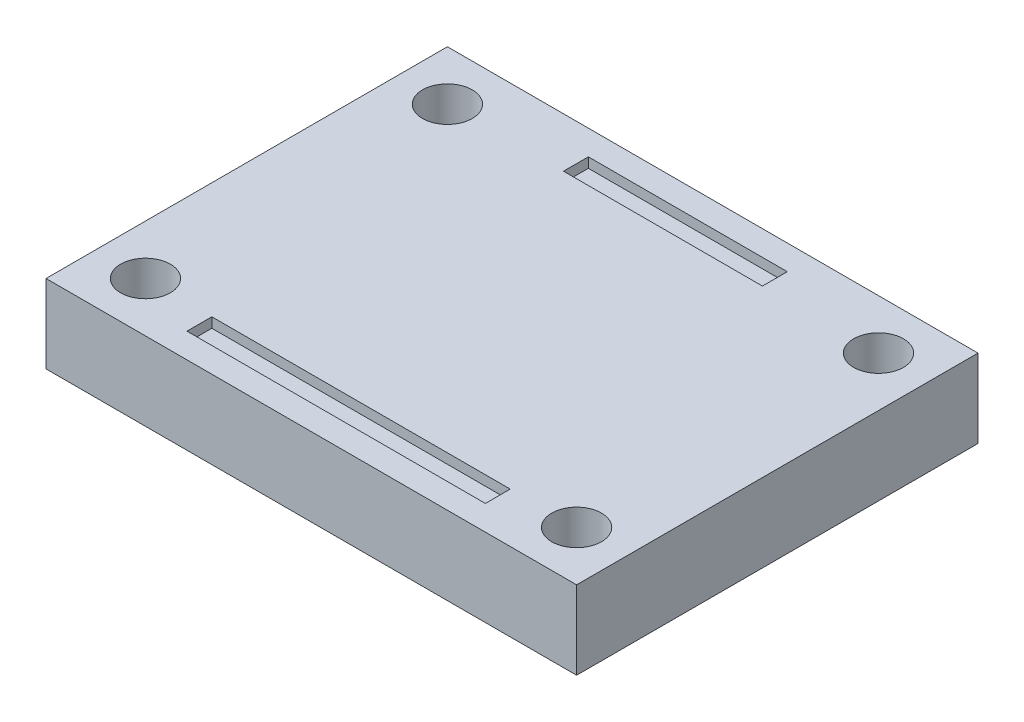
ISO-10303-21;
HEADER;
FILE_DESCRIPTION(('STEP AP214'),'2;1');
FILE_NAME('part.step','',(''),(''),'','','');
FILE_SCHEMA(('AUTOMOTIVE_DESIGN { 1 0 10303 214 1 1 1 1 }'));
ENDSEC;
DATA;
#1=APPLICATION_CONTEXT('core data for automotive mechanical design processes');
#2=APPLICATION_PROTOCOL_DEFINITION('international standard','automotive_design',2000,#1);
#3=PRODUCT_CONTEXT('',#1,'mechanical');
#4=PRODUCT('Part','Part','',(#3));
#5=PRODUCT_RELATED_PRODUCT_CATEGORY('part','',(#4));
#6=PRODUCT_DEFINITION_FORMATION('','',#4);
#7=PRODUCT_DEFINITION_CONTEXT('part definition',#1,'design');
#8=PRODUCT_DEFINITION('design','',#6,#7);
#9=PRODUCT_DEFINITION_SHAPE('','',#8);
#10=(LENGTH_UNIT() NAMED_UNIT(*) SI_UNIT(.MILLI.,.METRE.));
#11=(NAMED_UNIT(*) PLANE_ANGLE_UNIT() SI_UNIT($,.RADIAN.));
#12=(NAMED_UNIT(*) SI_UNIT($,.STERADIAN.) SOLID_ANGLE_UNIT());
#13=UNCERTAINTY_MEASURE_WITH_UNIT(LENGTH_MEASURE(1.E-05),#10,'distance_accuracy_value','');
#14=(GEOMETRIC_REPRESENTATION_CONTEXT(3) GLOBAL_UNCERTAINTY_ASSIGNED_CONTEXT((#13)) GLOBAL_UNIT_ASSIGNED_CONTEXT((#10,
#11,#12)) REPRESENTATION_CONTEXT('',''));
#15=CARTESIAN_POINT('',(0.,0.,0.));
#16=DIRECTION('',(0.,0.,1.));
#17=DIRECTION('',(1.,0.,0.));
#18=AXIS2_PLACEMENT_3D('',#15,#16,#17);
#19=CARTESIAN_POINT('',(0.,4.,0.));
#20=DIRECTION('',(-1.,0.,0.));
#21=DIRECTION('',(0.,0.,1.));
#22=AXIS2_PLACEMENT_3D('',#19,#20,#21);
#23=PLANE('',#22);
#24=DIRECTION('',(0.,0.,-1.));
#25=VECTOR('',#24,1.);
#26=CARTESIAN_POINT('',(0.,0.,0.));
#27=LINE('',#26,#25);
#28=CARTESIAN_POINT('',(0.,0.,0.));
#29=VERTEX_POINT('',#28);
#30=CARTESIAN_POINT('',(0.,0.,-20.5));
#31=VERTEX_POINT('',#30);
#32=EDGE_CURVE('E214',#29,#31,#27,.T.);
#33=ORIENTED_EDGE('',*,*,#32,.F.);
#34=DIRECTION('',(0.,-1.,0.));
#35=VECTOR('',#34,1.);
#36=CARTESIAN_POINT('',(0.,4.,0.));
#37=LINE('',#36,#35);
#38=CARTESIAN_POINT('',(0.,4.,0.));
#39=VERTEX_POINT('',#38);
#40=EDGE_CURVE('E11',#39,#29,#37,.T.);
#41=ORIENTED_EDGE('',*,*,#40,.F.);
#42=DIRECTION('',(0.,0.,-1.));
#43=VECTOR('',#42,1.);
#44=CARTESIAN_POINT('',(0.,4.,0.));
#45=LINE('',#44,#43);
#46=CARTESIAN_POINT('',(0.,4.,-20.5));
#47=VERTEX_POINT('',#46);
#48=EDGE_CURVE('E217',#39,#47,#45,.T.);
#49=ORIENTED_EDGE('',*,*,#48,.T.);
#50=DIRECTION('',(0.,-1.,0.));
#51=VECTOR('',#50,1.);
#52=CARTESIAN_POINT('',(0.,4.,-20.5));
#53=LINE('',#52,#51);
#54=EDGE_CURVE('E38',#47,#31,#53,.T.);
#55=ORIENTED_EDGE('',*,*,#54,.T.);
#56=EDGE_LOOP('',(#33,#41,#49,#55));
#57=FACE_BOUND('',#56,.T.);
#58=ADVANCED_FACE('F35',(#57),#23,.T.);
#59=CARTESIAN_POINT('',(0.,4.,0.));
#60=DIRECTION('',(0.,0.,-1.));
#61=DIRECTION('',(-1.,0.,0.));
#62=AXIS2_PLACEMENT_3D('',#59,#60,#61);
#63=PLANE('',#62);
#64=DIRECTION('',(1.,0.,0.));
#65=VECTOR('',#64,1.);
#66=CARTESIAN_POINT('',(0.,0.,0.));
#67=LINE('',#66,#65);
#68=CARTESIAN_POINT('',(27.1,0.,0.));
#69=VERTEX_POINT('',#68);
#70=EDGE_CURVE('E221',#29,#69,#67,.T.);
#71=ORIENTED_EDGE('',*,*,#70,.T.);
#72=DIRECTION('',(0.,-1.,0.));
#73=VECTOR('',#72,1.);
#74=CARTESIAN_POINT('',(27.1,4.,0.));
#75=LINE('',#74,#73);
#76=CARTESIAN_POINT('',(27.1,4.,0.));
#77=VERTEX_POINT('',#76);
#78=EDGE_CURVE('E43',#77,#69,#75,.T.);
#79=ORIENTED_EDGE('',*,*,#78,.F.);
#80=DIRECTION('',(1.,0.,0.));
#81=VECTOR('',#80,1.);
#82=CARTESIAN_POINT('',(0.,4.,0.));
#83=LINE('',#82,#81);
#84=EDGE_CURVE('E226',#39,#77,#83,.T.);
#85=ORIENTED_EDGE('',*,*,#84,.F.);
#86=ORIENTED_EDGE('',*,*,#40,.T.);
#87=EDGE_LOOP('',(#71,#79,#85,#86));
#88=FACE_BOUND('',#87,.T.);
#89=ADVANCED_FACE('F253',(#88),#63,.F.);
#90=CARTESIAN_POINT('',(27.1,4.,0.));
#91=DIRECTION('',(-1.,0.,0.));
#92=DIRECTION('',(0.,0.,1.));
#93=AXIS2_PLACEMENT_3D('',#90,#91,#92);
#94=PLANE('',#93);
#95=DIRECTION('',(0.,0.,-1.));
#96=VECTOR('',#95,1.);
#97=CARTESIAN_POINT('',(27.1,0.,0.));
#98=LINE('',#97,#96);
#99=CARTESIAN_POINT('',(27.1,0.,-20.5));
#100=VERTEX_POINT('',#99);
#101=EDGE_CURVE('E233',#69,#100,#98,.T.);
#102=ORIENTED_EDGE('',*,*,#101,.T.);
#103=DIRECTION('',(0.,-1.,0.));
#104=VECTOR('',#103,1.);
#105=CARTESIAN_POINT('',(27.1,4.,-20.5));
#106=LINE('',#105,#104);
#107=CARTESIAN_POINT('',(27.1,4.,-20.5));
#108=VERTEX_POINT('',#107);
#109=EDGE_CURVE('E238',#108,#100,#106,.T.);
#110=ORIENTED_EDGE('',*,*,#109,.F.);
#111=DIRECTION('',(0.,0.,-1.));
#112=VECTOR('',#111,1.);
#113=CARTESIAN_POINT('',(27.1,4.,0.));
#114=LINE('',#113,#112);
#115=EDGE_CURVE('E224',#77,#108,#114,.T.);
#116=ORIENTED_EDGE('',*,*,#115,.F.);
#117=ORIENTED_EDGE('',*,*,#78,.T.);
#118=EDGE_LOOP('',(#102,#110,#116,#117));
#119=FACE_BOUND('',#118,.T.);
#120=ADVANCED_FACE('F257',(#119),#94,.F.);
#121=CARTESIAN_POINT('',(0.,4.,-20.5));
#122=DIRECTION('',(0.,0.,-1.));
#123=DIRECTION('',(-1.,0.,0.));
#124=AXIS2_PLACEMENT_3D('',#121,#122,#123);
#125=PLANE('',#124);
#126=DIRECTION('',(1.,0.,0.));
#127=VECTOR('',#126,1.);
#128=CARTESIAN_POINT('',(0.,0.,-20.5));
#129=LINE('',#128,#127);
#130=EDGE_CURVE('E230',#31,#100,#129,.T.);
#131=ORIENTED_EDGE('',*,*,#130,.F.);
#132=ORIENTED_EDGE('',*,*,#54,.F.);
#133=DIRECTION('',(1.,0.,0.));
#134=VECTOR('',#133,1.);
#135=CARTESIAN_POINT('',(0.,4.,-20.5));
#136=LINE('',#135,#134);
#137=EDGE_CURVE('E220',#47,#108,#136,.T.);
#138=ORIENTED_EDGE('',*,*,#137,.T.);
#139=ORIENTED_EDGE('',*,*,#109,.T.);
#140=EDGE_LOOP('',(#131,#132,#138,#139));
#141=FACE_BOUND('',#140,.T.);
#142=ADVANCED_FACE('F246',(#141),#125,.T.);
#143=CARTESIAN_POINT('',(0.,4.,0.));
#144=DIRECTION('',(0.,-1.,0.));
#145=DIRECTION('',(0.,0.,-1.));
#146=AXIS2_PLACEMENT_3D('',#143,#144,#145);
#147=PLANE('',#146);
#148=DIRECTION('',(-1.,0.,0.));
#149=VECTOR('',#148,1.);
#150=CARTESIAN_POINT('',(5.93,4.,-2.54));
#151=LINE('',#150,#149);
#152=CARTESIAN_POINT('',(21.17,4.,-2.54));
#153=VERTEX_POINT('',#152);
#154=CARTESIAN_POINT('',(5.93,4.,-2.54));
#155=VERTEX_POINT('',#154);
#156=EDGE_CURVE('E153',#153,#155,#151,.T.);
#157=ORIENTED_EDGE('',*,*,#156,.F.);
#158=DIRECTION('',(0.,0.,-1.));
#159=VECTOR('',#158,1.);
#160=CARTESIAN_POINT('',(21.17,4.,-2.54));
#161=LINE('',#160,#159);
#162=CARTESIAN_POINT('',(21.17,4.,-1.27));
#163=VERTEX_POINT('',#162);
#164=EDGE_CURVE('E51',#163,#153,#161,.T.);
#165=ORIENTED_EDGE('',*,*,#164,.F.);
#166=DIRECTION('',(1.,0.,0.));
#167=VECTOR('',#166,1.);
#168=CARTESIAN_POINT('',(5.93,4.,-1.27));
#169=LINE('',#168,#167);
#170=CARTESIAN_POINT('',(5.93,4.,-1.27));
#171=VERTEX_POINT('',#170);
#172=EDGE_CURVE('E144',#171,#163,#169,.T.);
#173=ORIENTED_EDGE('',*,*,#172,.F.);
#174=DIRECTION('',(0.,0.,1.));
#175=VECTOR('',#174,1.);
#176=CARTESIAN_POINT('',(5.93,4.,-2.54));
#177=LINE('',#176,#175);
#178=EDGE_CURVE('E147',#155,#171,#177,.T.);
#179=ORIENTED_EDGE('',*,*,#178,.F.);
#180=EDGE_LOOP('',(#157,#165,#173,#179));
#181=FACE_BOUND('',#180,.T.);
#182=DIRECTION('',(-1.,0.,0.));
#183=VECTOR('',#182,1.);
#184=CARTESIAN_POINT('',(8.47,4.,-19.23));
#185=LINE('',#184,#183);
#186=CARTESIAN_POINT('',(18.63,4.,-19.23));
#187=VERTEX_POINT('',#186);
#188=CARTESIAN_POINT('',(8.47,4.,-19.23));
#189=VERTEX_POINT('',#188);
#190=EDGE_CURVE('E177',#187,#189,#185,.T.);
#191=ORIENTED_EDGE('',*,*,#190,.F.);
#192=DIRECTION('',(0.,0.,-1.));
#193=VECTOR('',#192,1.);
#194=CARTESIAN_POINT('',(18.63,4.,-19.23));
#195=LINE('',#194,#193);
#196=CARTESIAN_POINT('',(18.63,4.,-17.96));
#197=VERTEX_POINT('',#196);
#198=EDGE_CURVE('E59',#197,#187,#195,.T.);
#199=ORIENTED_EDGE('',*,*,#198,.F.);
#200=DIRECTION('',(1.,0.,0.));
#201=VECTOR('',#200,1.);
#202=CARTESIAN_POINT('',(8.47,4.,-17.96));
#203=LINE('',#202,#201);
#204=CARTESIAN_POINT('',(8.47,4.,-17.96));
#205=VERTEX_POINT('',#204);
#206=EDGE_CURVE('E166',#205,#197,#203,.T.);
#207=ORIENTED_EDGE('',*,*,#206,.F.);
#208=DIRECTION('',(0.,0.,1.));
#209=VECTOR('',#208,1.);
#210=CARTESIAN_POINT('',(8.47,4.,-19.23));
#211=LINE('',#210,#209);
#212=EDGE_CURVE('E180',#189,#205,#211,.T.);
#213=ORIENTED_EDGE('',*,*,#212,.F.);
#214=EDGE_LOOP('',(#191,#199,#207,#213));
#215=FACE_BOUND('',#214,.T.);
#216=CARTESIAN_POINT('',(2.54,4.,-2.54));
#217=DIRECTION('',(0.,1.,0.));
#218=DIRECTION('',(0.,0.,-1.));
#219=AXIS2_PLACEMENT_3D('',#216,#217,#218);
#220=CIRCLE('',#219,1.27);
#221=CARTESIAN_POINT('',(2.54,4.,-3.81));
#222=VERTEX_POINT('',#221);
#223=EDGE_CURVE('E197',#222,#222,#220,.T.);
#224=ORIENTED_EDGE('',*,*,#223,.F.);
#225=EDGE_LOOP('',(#224));
#226=FACE_BOUND('',#225,.T.);
#227=CARTESIAN_POINT('',(24.56,4.,-2.54));
#228=DIRECTION('',(0.,1.,0.));
#229=DIRECTION('',(0.,0.,1.));
#230=AXIS2_PLACEMENT_3D('',#227,#228,#229);
#231=CIRCLE('',#230,1.27);
#232=CARTESIAN_POINT('',(24.56,4.,-1.27));
#233=VERTEX_POINT('',#232);
#234=EDGE_CURVE('E203',#233,#233,#231,.T.);
#235=ORIENTED_EDGE('',*,*,#234,.F.);
#236=EDGE_LOOP('',(#235));
#237=FACE_BOUND('',#236,.T.);
#238=CARTESIAN_POINT('',(24.56,4.,-17.96));
#239=DIRECTION('',(0.,1.,0.));
#240=DIRECTION('',(0.,0.,-1.));
#241=AXIS2_PLACEMENT_3D('',#238,#239,#240);
#242=CIRCLE('',#241,1.27);
#243=CARTESIAN_POINT('',(24.56,4.,-19.23));
#244=VERTEX_POINT('',#243);
#245=EDGE_CURVE('E187',#244,#244,#242,.T.);
#246=ORIENTED_EDGE('',*,*,#245,.F.);
#247=EDGE_LOOP('',(#246));
#248=FACE_BOUND('',#247,.T.);
#249=CARTESIAN_POINT('',(2.54,4.,-17.96));
#250=DIRECTION('',(0.,1.,0.));
#251=DIRECTION('',(0.,0.,1.));
#252=AXIS2_PLACEMENT_3D('',#249,#250,#251);
#253=CIRCLE('',#252,1.27);
#254=CARTESIAN_POINT('',(2.54,4.,-16.69));
#255=VERTEX_POINT('',#254);
#256=EDGE_CURVE('E196',#255,#255,#253,.T.);
#257=ORIENTED_EDGE('',*,*,#256,.F.);
#258=EDGE_LOOP('',(#257));
#259=FACE_BOUND('',#258,.T.);
#260=ORIENTED_EDGE('',*,*,#48,.F.);
#261=ORIENTED_EDGE('',*,*,#84,.T.);
#262=ORIENTED_EDGE('',*,*,#115,.T.);
#263=ORIENTED_EDGE('',*,*,#137,.F.);
#264=EDGE_LOOP('',(#260,#261,#262,#263));
#265=FACE_BOUND('',#264,.T.);
#266=ADVANCED_FACE('F259',(#181,#215,#226,#237,#248,#259,#265),#147,.F.);
#267=CARTESIAN_POINT('',(0.,0.,0.));
#268=DIRECTION('',(0.,-1.,0.));
#269=DIRECTION('',(0.,0.,-1.));
#270=AXIS2_PLACEMENT_3D('',#267,#268,#269);
#271=PLANE('',#270);
#272=CARTESIAN_POINT('',(2.54,0.,-2.54));
#273=DIRECTION('',(0.,1.,0.));
#274=DIRECTION('',(0.,0.,-1.));
#275=AXIS2_PLACEMENT_3D('',#272,#273,#274);
#276=CIRCLE('',#275,1.27);
#277=CARTESIAN_POINT('',(2.54,0.,-3.81));
#278=VERTEX_POINT('',#277);
#279=EDGE_CURVE('E193',#278,#278,#276,.T.);
#280=ORIENTED_EDGE('',*,*,#279,.T.);
#281=EDGE_LOOP('',(#280));
#282=FACE_BOUND('',#281,.T.);
#283=CARTESIAN_POINT('',(24.56,0.,-2.54));
#284=DIRECTION('',(0.,1.,0.));
#285=DIRECTION('',(0.,0.,1.));
#286=AXIS2_PLACEMENT_3D('',#283,#284,#285);
#287=CIRCLE('',#286,1.27);
#288=CARTESIAN_POINT('',(24.56,0.,-1.27));
#289=VERTEX_POINT('',#288);
#290=EDGE_CURVE('E200',#289,#289,#287,.T.);
#291=ORIENTED_EDGE('',*,*,#290,.T.);
#292=EDGE_LOOP('',(#291));
#293=FACE_BOUND('',#292,.T.);
#294=CARTESIAN_POINT('',(24.56,0.,-17.96));
#295=DIRECTION('',(0.,1.,0.));
#296=DIRECTION('',(0.,0.,-1.));
#297=AXIS2_PLACEMENT_3D('',#294,#295,#296);
#298=CIRCLE('',#297,1.27);
#299=CARTESIAN_POINT('',(24.56,0.,-19.23));
#300=VERTEX_POINT('',#299);
#301=EDGE_CURVE('E206',#300,#300,#298,.T.);
#302=ORIENTED_EDGE('',*,*,#301,.T.);
#303=EDGE_LOOP('',(#302));
#304=FACE_BOUND('',#303,.T.);
#305=CARTESIAN_POINT('',(2.54,0.,-17.96));
#306=DIRECTION('',(0.,1.,0.));
#307=DIRECTION('',(0.,0.,1.));
#308=AXIS2_PLACEMENT_3D('',#305,#306,#307);
#309=CIRCLE('',#308,1.27);
#310=CARTESIAN_POINT('',(2.54,0.,-16.69));
#311=VERTEX_POINT('',#310);
#312=EDGE_CURVE('E211',#311,#311,#309,.T.);
#313=ORIENTED_EDGE('',*,*,#312,.T.);
#314=EDGE_LOOP('',(#313));
#315=FACE_BOUND('',#314,.T.);
#316=ORIENTED_EDGE('',*,*,#32,.T.);
#317=ORIENTED_EDGE('',*,*,#130,.T.);
#318=ORIENTED_EDGE('',*,*,#101,.F.);
#319=ORIENTED_EDGE('',*,*,#70,.F.);
#320=EDGE_LOOP('',(#316,#317,#318,#319));
#321=FACE_BOUND('',#320,.T.);
#322=ADVANCED_FACE('F250',(#282,#293,#304,#315,#321),#271,.T.);
#323=CARTESIAN_POINT('',(2.54,0.,-17.96));
#324=DIRECTION('',(0.,1.,0.));
#325=DIRECTION('',(0.,0.,1.));
#326=AXIS2_PLACEMENT_3D('',#323,#324,#325);
#327=CYLINDRICAL_SURFACE('',#326,1.27);
#328=ORIENTED_EDGE('',*,*,#312,.F.);
#329=EDGE_LOOP('',(#328));
#330=FACE_BOUND('',#329,.T.);
#331=ORIENTED_EDGE('',*,*,#256,.T.);
#332=EDGE_LOOP('',(#331));
#333=FACE_BOUND('',#332,.T.);
#334=ADVANCED_FACE('F267',(#330,#333),#327,.F.);
#335=CARTESIAN_POINT('',(24.56,0.,-17.96));
#336=DIRECTION('',(0.,1.,0.));
#337=DIRECTION('',(0.,0.,1.));
#338=AXIS2_PLACEMENT_3D('',#335,#336,#337);
#339=CYLINDRICAL_SURFACE('',#338,1.27);
#340=ORIENTED_EDGE('',*,*,#301,.F.);
#341=EDGE_LOOP('',(#340));
#342=FACE_BOUND('',#341,.T.);
#343=ORIENTED_EDGE('',*,*,#245,.T.);
#344=EDGE_LOOP('',(#343));
#345=FACE_BOUND('',#344,.T.);
#346=ADVANCED_FACE('F303',(#342,#345),#339,.F.);
#347=CARTESIAN_POINT('',(24.56,0.,-2.54));
#348=DIRECTION('',(0.,1.,0.));
#349=DIRECTION('',(0.,0.,1.));
#350=AXIS2_PLACEMENT_3D('',#347,#348,#349);
#351=CYLINDRICAL_SURFACE('',#350,1.27);
#352=ORIENTED_EDGE('',*,*,#290,.F.);
#353=EDGE_LOOP('',(#352));
#354=FACE_BOUND('',#353,.T.);
#355=ORIENTED_EDGE('',*,*,#234,.T.);
#356=EDGE_LOOP('',(#355));
#357=FACE_BOUND('',#356,.T.);
#358=ADVANCED_FACE('F312',(#354,#357),#351,.F.);
#359=CARTESIAN_POINT('',(2.54,0.,-2.54));
#360=DIRECTION('',(0.,1.,0.));
#361=DIRECTION('',(0.,0.,1.));
#362=AXIS2_PLACEMENT_3D('',#359,#360,#361);
#363=CYLINDRICAL_SURFACE('',#362,1.27);
#364=ORIENTED_EDGE('',*,*,#279,.F.);
#365=EDGE_LOOP('',(#364));
#366=FACE_BOUND('',#365,.T.);
#367=ORIENTED_EDGE('',*,*,#223,.T.);
#368=EDGE_LOOP('',(#367));
#369=FACE_BOUND('',#368,.T.);
#370=ADVANCED_FACE('F322',(#366,#369),#363,.F.);
#371=CARTESIAN_POINT('',(18.63,3.492,-19.23));
#372=DIRECTION('',(1.,0.,0.));
#373=DIRECTION('',(0.,0.,-1.));
#374=AXIS2_PLACEMENT_3D('',#371,#372,#373);
#375=PLANE('',#374);
#376=ORIENTED_EDGE('',*,*,#198,.T.);
#377=DIRECTION('',(0.,1.,0.));
#378=VECTOR('',#377,1.);
#379=CARTESIAN_POINT('',(18.63,3.492,-19.23));
#380=LINE('',#379,#378);
#381=CARTESIAN_POINT('',(18.63,3.492,-19.23));
#382=VERTEX_POINT('',#381);
#383=EDGE_CURVE('E175',#382,#187,#380,.T.);
#384=ORIENTED_EDGE('',*,*,#383,.F.);
#385=DIRECTION('',(0.,0.,-1.));
#386=VECTOR('',#385,1.);
#387=CARTESIAN_POINT('',(18.63,3.492,-19.23));
#388=LINE('',#387,#386);
#389=CARTESIAN_POINT('',(18.63,3.492,-17.96));
#390=VERTEX_POINT('',#389);
#391=EDGE_CURVE('E162',#390,#382,#388,.T.);
#392=ORIENTED_EDGE('',*,*,#391,.F.);
#393=DIRECTION('',(0.,1.,0.));
#394=VECTOR('',#393,1.);
#395=CARTESIAN_POINT('',(18.63,3.492,-17.96));
#396=LINE('',#395,#394);
#397=EDGE_CURVE('E185',#390,#197,#396,.T.);
#398=ORIENTED_EDGE('',*,*,#397,.T.);
#399=EDGE_LOOP('',(#376,#384,#392,#398));
#400=FACE_BOUND('',#399,.T.);
#401=ADVANCED_FACE('F331',(#400),#375,.F.);
#402=CARTESIAN_POINT('',(8.47,3.492,-17.96));
#403=DIRECTION('',(0.,0.,1.));
#404=DIRECTION('',(1.,0.,0.));
#405=AXIS2_PLACEMENT_3D('',#402,#403,#404);
#406=PLANE('',#405);
#407=ORIENTED_EDGE('',*,*,#206,.T.);
#408=ORIENTED_EDGE('',*,*,#397,.F.);
#409=DIRECTION('',(1.,0.,0.));
#410=VECTOR('',#409,1.);
#411=CARTESIAN_POINT('',(8.47,3.492,-17.96));
#412=LINE('',#411,#410);
#413=CARTESIAN_POINT('',(8.47,3.492,-17.96));
#414=VERTEX_POINT('',#413);
#415=EDGE_CURVE('E172',#414,#390,#412,.T.);
#416=ORIENTED_EDGE('',*,*,#415,.F.);
#417=DIRECTION('',(0.,1.,0.));
#418=VECTOR('',#417,1.);
#419=CARTESIAN_POINT('',(8.47,3.492,-17.96));
#420=LINE('',#419,#418);
#421=EDGE_CURVE('E188',#414,#205,#420,.T.);
#422=ORIENTED_EDGE('',*,*,#421,.T.);
#423=EDGE_LOOP('',(#407,#408,#416,#422));
#424=FACE_BOUND('',#423,.T.);
#425=ADVANCED_FACE('F345',(#424),#406,.F.);
#426=CARTESIAN_POINT('',(8.47,3.492,-19.23));
#427=DIRECTION('',(-1.,0.,0.));
#428=DIRECTION('',(0.,0.,1.));
#429=AXIS2_PLACEMENT_3D('',#426,#427,#428);
#430=PLANE('',#429);
#431=ORIENTED_EDGE('',*,*,#212,.T.);
#432=ORIENTED_EDGE('',*,*,#421,.F.);
#433=DIRECTION('',(0.,0.,1.));
#434=VECTOR('',#433,1.);
#435=CARTESIAN_POINT('',(8.47,3.492,-19.23));
#436=LINE('',#435,#434);
#437=CARTESIAN_POINT('',(8.47,3.492,-19.23));
#438=VERTEX_POINT('',#437);
#439=EDGE_CURVE('E169',#438,#414,#436,.T.);
#440=ORIENTED_EDGE('',*,*,#439,.F.);
#441=DIRECTION('',(0.,1.,0.));
#442=VECTOR('',#441,1.);
#443=CARTESIAN_POINT('',(8.47,3.492,-19.23));
#444=LINE('',#443,#442);
#445=EDGE_CURVE('E190',#438,#189,#444,.T.);
#446=ORIENTED_EDGE('',*,*,#445,.T.);
#447=EDGE_LOOP('',(#431,#432,#440,#446));
#448=FACE_BOUND('',#447,.T.);
#449=ADVANCED_FACE('F354',(#448),#430,.F.);
#450=CARTESIAN_POINT('',(8.47,3.492,-19.23));
#451=DIRECTION('',(0.,0.,-1.));
#452=DIRECTION('',(-1.,0.,0.));
#453=AXIS2_PLACEMENT_3D('',#450,#451,#452);
#454=PLANE('',#453);
#455=ORIENTED_EDGE('',*,*,#190,.T.);
#456=ORIENTED_EDGE('',*,*,#445,.F.);
#457=DIRECTION('',(-1.,0.,0.));
#458=VECTOR('',#457,1.);
#459=CARTESIAN_POINT('',(8.47,3.492,-19.23));
#460=LINE('',#459,#458);
#461=EDGE_CURVE('E165',#382,#438,#460,.T.);
#462=ORIENTED_EDGE('',*,*,#461,.F.);
#463=ORIENTED_EDGE('',*,*,#383,.T.);
#464=EDGE_LOOP('',(#455,#456,#462,#463));
#465=FACE_BOUND('',#464,.T.);
#466=ADVANCED_FACE('F364',(#465),#454,.F.);
#467=CARTESIAN_POINT('',(0.,3.492,0.));
#468=DIRECTION('',(0.,1.,0.));
#469=DIRECTION('',(0.,0.,1.));
#470=AXIS2_PLACEMENT_3D('',#467,#468,#469);
#471=PLANE('',#470);
#472=ORIENTED_EDGE('',*,*,#391,.T.);
#473=ORIENTED_EDGE('',*,*,#461,.T.);
#474=ORIENTED_EDGE('',*,*,#439,.T.);
#475=ORIENTED_EDGE('',*,*,#415,.T.);
#476=EDGE_LOOP('',(#472,#473,#474,#475));
#477=FACE_BOUND('',#476,.T.);
#478=ADVANCED_FACE('F374',(#477),#471,.T.);
#479=CARTESIAN_POINT('',(21.17,3.492,-2.54));
#480=DIRECTION('',(1.,0.,0.));
#481=DIRECTION('',(0.,0.,-1.));
#482=AXIS2_PLACEMENT_3D('',#479,#480,#481);
#483=PLANE('',#482);
#484=ORIENTED_EDGE('',*,*,#164,.T.);
#485=DIRECTION('',(0.,1.,0.));
#486=VECTOR('',#485,1.);
#487=CARTESIAN_POINT('',(21.17,3.492,-2.54));
#488=LINE('',#487,#486);
#489=CARTESIAN_POINT('',(21.17,3.492,-2.54));
#490=VERTEX_POINT('',#489);
#491=EDGE_CURVE('E122',#490,#153,#488,.T.);
#492=ORIENTED_EDGE('',*,*,#491,.F.);
#493=DIRECTION('',(0.,0.,-1.));
#494=VECTOR('',#493,1.);
#495=CARTESIAN_POINT('',(21.17,3.492,-2.54));
#496=LINE('',#495,#494);
#497=CARTESIAN_POINT('',(21.17,3.492,-1.27));
#498=VERTEX_POINT('',#497);
#499=EDGE_CURVE('E126',#498,#490,#496,.T.);
#500=ORIENTED_EDGE('',*,*,#499,.F.);
#501=DIRECTION('',(0.,1.,0.));
#502=VECTOR('',#501,1.);
#503=CARTESIAN_POINT('',(21.17,3.492,-1.27));
#504=LINE('',#503,#502);
#505=EDGE_CURVE('E157',#498,#163,#504,.T.);
#506=ORIENTED_EDGE('',*,*,#505,.T.);
#507=EDGE_LOOP('',(#484,#492,#500,#506));
#508=FACE_BOUND('',#507,.T.);
#509=ADVANCED_FACE('F124',(#508),#483,.F.);
#510=CARTESIAN_POINT('',(5.93,3.492,-1.27));
#511=DIRECTION('',(0.,0.,1.));
#512=DIRECTION('',(1.,0.,0.));
#513=AXIS2_PLACEMENT_3D('',#510,#511,#512);
#514=PLANE('',#513);
#515=ORIENTED_EDGE('',*,*,#172,.T.);
#516=ORIENTED_EDGE('',*,*,#505,.F.);
#517=DIRECTION('',(1.,0.,0.));
#518=VECTOR('',#517,1.);
#519=CARTESIAN_POINT('',(5.93,3.492,-1.27));
#520=LINE('',#519,#518);
#521=CARTESIAN_POINT('',(5.93,3.492,-1.27));
#522=VERTEX_POINT('',#521);
#523=EDGE_CURVE('E132',#522,#498,#520,.T.);
#524=ORIENTED_EDGE('',*,*,#523,.F.);
#525=DIRECTION('',(0.,1.,0.));
#526=VECTOR('',#525,1.);
#527=CARTESIAN_POINT('',(5.93,3.492,-1.27));
#528=LINE('',#527,#526);
#529=EDGE_CURVE('E159',#522,#171,#528,.T.);
#530=ORIENTED_EDGE('',*,*,#529,.T.);
#531=EDGE_LOOP('',(#515,#516,#524,#530));
#532=FACE_BOUND('',#531,.T.);
#533=ADVANCED_FACE('F393',(#532),#514,.F.);
#534=CARTESIAN_POINT('',(5.93,3.492,-2.54));
#535=DIRECTION('',(-1.,0.,0.));
#536=DIRECTION('',(0.,0.,1.));
#537=AXIS2_PLACEMENT_3D('',#534,#535,#536);
#538=PLANE('',#537);
#539=ORIENTED_EDGE('',*,*,#178,.T.);
#540=ORIENTED_EDGE('',*,*,#529,.F.);
#541=DIRECTION('',(0.,0.,1.));
#542=VECTOR('',#541,1.);
#543=CARTESIAN_POINT('',(5.93,3.492,-2.54));
#544=LINE('',#543,#542);
#545=CARTESIAN_POINT('',(5.93,3.492,-2.54));
#546=VERTEX_POINT('',#545);
#547=EDGE_CURVE('E140',#546,#522,#544,.T.);
#548=ORIENTED_EDGE('',*,*,#547,.F.);
#549=DIRECTION('',(0.,1.,0.));
#550=VECTOR('',#549,1.);
#551=CARTESIAN_POINT('',(5.93,3.492,-2.54));
#552=LINE('',#551,#550);
#553=EDGE_CURVE('E131',#546,#155,#552,.T.);
#554=ORIENTED_EDGE('',*,*,#553,.T.);
#555=EDGE_LOOP('',(#539,#540,#548,#554));
#556=FACE_BOUND('',#555,.T.);
#557=ADVANCED_FACE('F402',(#556),#538,.F.);
#558=CARTESIAN_POINT('',(5.93,3.492,-2.54));
#559=DIRECTION('',(0.,0.,-1.));
#560=DIRECTION('',(-1.,0.,0.));
#561=AXIS2_PLACEMENT_3D('',#558,#559,#560);
#562=PLANE('',#561);
#563=ORIENTED_EDGE('',*,*,#156,.T.);
#564=ORIENTED_EDGE('',*,*,#553,.F.);
#565=DIRECTION('',(-1.,0.,0.));
#566=VECTOR('',#565,1.);
#567=CARTESIAN_POINT('',(5.93,3.492,-2.54));
#568=LINE('',#567,#566);
#569=EDGE_CURVE('E135',#490,#546,#568,.T.);
#570=ORIENTED_EDGE('',*,*,#569,.F.);
#571=ORIENTED_EDGE('',*,*,#491,.T.);
#572=EDGE_LOOP('',(#563,#564,#570,#571));
#573=FACE_BOUND('',#572,.T.);
#574=ADVANCED_FACE('F136',(#573),#562,.F.);
#575=CARTESIAN_POINT('',(0.,3.492,0.));
#576=DIRECTION('',(0.,1.,0.));
#577=DIRECTION('',(0.,0.,1.));
#578=AXIS2_PLACEMENT_3D('',#575,#576,#577);
#579=PLANE('',#578);
#580=ORIENTED_EDGE('',*,*,#499,.T.);
#581=ORIENTED_EDGE('',*,*,#569,.T.);
#582=ORIENTED_EDGE('',*,*,#547,.T.);
#583=ORIENTED_EDGE('',*,*,#523,.T.);
#584=EDGE_LOOP('',(#580,#581,#582,#583));
#585=FACE_BOUND('',#584,.T.);
#586=ADVANCED_FACE('F142',(#585),#579,.T.);
#587=CLOSED_SHELL('',(#58,#89,#120,#142,#266,#322,#334,#346,#358,#370,#401,#425,#449,#466,#478,
#509,#533,#557,#574,#586));
#588=MANIFOLD_SOLID_BREP('B2',#587);
#589=ADVANCED_BREP_SHAPE_REPRESENTATION('',(#18,#588),#14);
#590=SHAPE_DEFINITION_REPRESENTATION(#9,#589);
ENDSEC;
END-ISO-10303-21;
